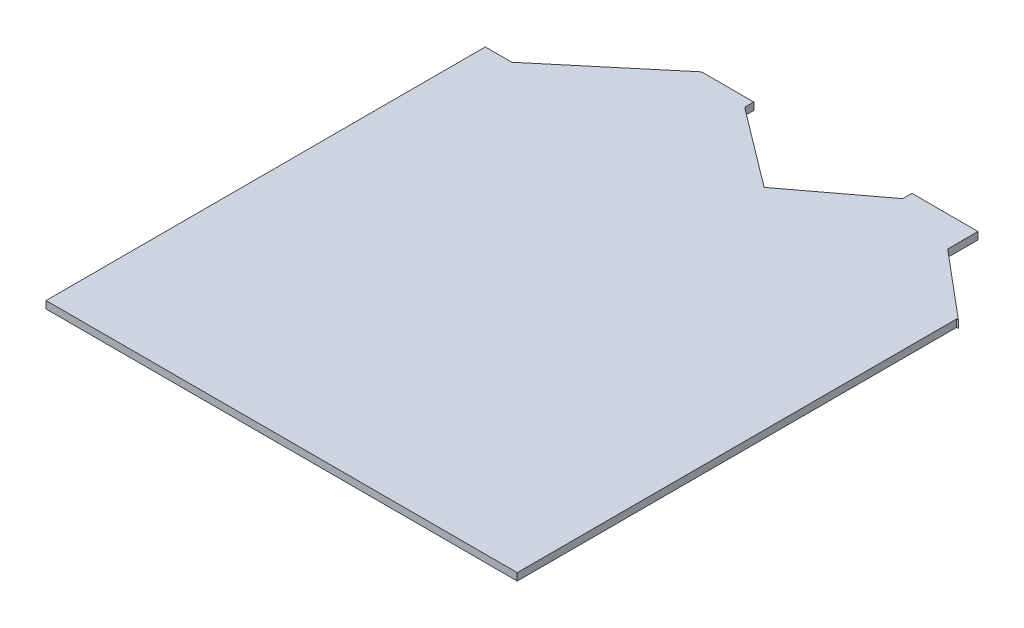
ISO-10303-21;
HEADER;
FILE_DESCRIPTION(('STEP AP214'),'2;1');
FILE_NAME('part.step','',(''),(''),'','','');
FILE_SCHEMA(('AUTOMOTIVE_DESIGN { 1 0 10303 214 1 1 1 1 }'));
ENDSEC;
DATA;
#1=APPLICATION_CONTEXT('core data for automotive mechanical design processes');
#2=APPLICATION_PROTOCOL_DEFINITION('international standard','automotive_design',2000,#1);
#3=PRODUCT_CONTEXT('',#1,'mechanical');
#4=PRODUCT('Part','Part','',(#3));
#5=PRODUCT_RELATED_PRODUCT_CATEGORY('part','',(#4));
#6=PRODUCT_DEFINITION_FORMATION('','',#4);
#7=PRODUCT_DEFINITION_CONTEXT('part definition',#1,'design');
#8=PRODUCT_DEFINITION('design','',#6,#7);
#9=PRODUCT_DEFINITION_SHAPE('','',#8);
#10=(LENGTH_UNIT() NAMED_UNIT(*) SI_UNIT(.MILLI.,.METRE.));
#11=(NAMED_UNIT(*) PLANE_ANGLE_UNIT() SI_UNIT($,.RADIAN.));
#12=(NAMED_UNIT(*) SI_UNIT($,.STERADIAN.) SOLID_ANGLE_UNIT());
#13=UNCERTAINTY_MEASURE_WITH_UNIT(LENGTH_MEASURE(1.E-05),#10,'distance_accuracy_value','');
#14=(GEOMETRIC_REPRESENTATION_CONTEXT(3) GLOBAL_UNCERTAINTY_ASSIGNED_CONTEXT((#13)) GLOBAL_UNIT_ASSIGNED_CONTEXT((#10,
#11,#12)) REPRESENTATION_CONTEXT('',''));
#15=CARTESIAN_POINT('',(0.,0.,0.));
#16=DIRECTION('',(0.,0.,1.));
#17=DIRECTION('',(1.,0.,0.));
#18=AXIS2_PLACEMENT_3D('',#15,#16,#17);
#19=CARTESIAN_POINT('',(950.,1291.,1751.15));
#20=DIRECTION('',(0.,1.,0.));
#21=DIRECTION('',(0.,0.,-1.));
#22=AXIS2_PLACEMENT_3D('',#19,#20,#21);
#23=PLANE('',#22);
#24=DIRECTION('',(1.,0.,0.));
#25=VECTOR('',#24,1.);
#26=CARTESIAN_POINT('',(-1180.,1291.,1751.15));
#27=LINE('',#26,#25);
#28=CARTESIAN_POINT('',(-1180.,1291.,1751.15));
#29=VERTEX_POINT('',#28);
#30=CARTESIAN_POINT('',(950.,1291.,1751.15));
#31=VERTEX_POINT('',#30);
#32=EDGE_CURVE('E40',#29,#31,#27,.T.);
#33=ORIENTED_EDGE('',*,*,#32,.F.);
#34=DIRECTION('',(0.,0.,1.));
#35=VECTOR('',#34,1.);
#36=CARTESIAN_POINT('',(-1180.,1291.,-234.349999999997));
#37=LINE('',#36,#35);
#38=CARTESIAN_POINT('',(-1180.,1291.,-234.349999999997));
#39=VERTEX_POINT('',#38);
#40=EDGE_CURVE('E189',#39,#29,#37,.T.);
#41=ORIENTED_EDGE('',*,*,#40,.F.);
#42=DIRECTION('',(-1.,0.,0.));
#43=VECTOR('',#42,1.);
#44=CARTESIAN_POINT('',(-1060.078564402,1291.,-234.349999999997));
#45=LINE('',#44,#43);
#46=CARTESIAN_POINT('',(-1060.078564402,1291.,-234.349999999997));
#47=VERTEX_POINT('',#46);
#48=EDGE_CURVE('E176',#47,#39,#45,.T.);
#49=ORIENTED_EDGE('',*,*,#48,.F.);
#50=DIRECTION('',(-0.766044443119007,0.,0.642787609686505));
#51=VECTOR('',#50,1.);
#52=CARTESIAN_POINT('',(-594.,1291.,-625.436351489597));
#53=LINE('',#52,#51);
#54=CARTESIAN_POINT('',(-594.,1291.,-625.436351489597));
#55=VERTEX_POINT('',#54);
#56=EDGE_CURVE('E237',#55,#47,#53,.T.);
#57=ORIENTED_EDGE('',*,*,#56,.F.);
#58=DIRECTION('',(-1.,0.,0.));
#59=VECTOR('',#58,1.);
#60=CARTESIAN_POINT('',(-357.5,1291.,-625.436351489597));
#61=LINE('',#60,#59);
#62=CARTESIAN_POINT('',(-357.5,1291.,-625.436351489597));
#63=VERTEX_POINT('',#62);
#64=EDGE_CURVE('E229',#63,#55,#61,.T.);
#65=ORIENTED_EDGE('',*,*,#64,.F.);
#66=DIRECTION('',(0.,0.,-1.));
#67=VECTOR('',#66,1.);
#68=CARTESIAN_POINT('',(-357.5,1291.,-584.245572911747));
#69=LINE('',#68,#67);
#70=CARTESIAN_POINT('',(-357.5,1291.,-584.245572911747));
#71=VERTEX_POINT('',#70);
#72=EDGE_CURVE('E177',#71,#63,#69,.T.);
#73=ORIENTED_EDGE('',*,*,#72,.F.);
#74=DIRECTION('',(-0.798635510047319,0.,-0.601815023152014));
#75=VECTOR('',#74,1.);
#76=CARTESIAN_POINT('',(-1.136868377216E-13,1291.,-314.85));
#77=LINE('',#76,#75);
#78=CARTESIAN_POINT('',(-1.136868377216E-13,1291.,-314.85));
#79=VERTEX_POINT('',#78);
#80=EDGE_CURVE('E155',#79,#71,#77,.T.);
#81=ORIENTED_EDGE('',*,*,#80,.F.);
#82=DIRECTION('',(-0.798635510047319,0.,0.601815023152014));
#83=VECTOR('',#82,1.);
#84=CARTESIAN_POINT('',(357.5,1291.,-584.245572911747));
#85=LINE('',#84,#83);
#86=CARTESIAN_POINT('',(357.5,1291.,-584.245572911747));
#87=VERTEX_POINT('',#86);
#88=EDGE_CURVE('E152',#87,#79,#85,.T.);
#89=ORIENTED_EDGE('',*,*,#88,.F.);
#90=DIRECTION('',(0.,0.,1.));
#91=VECTOR('',#90,1.);
#92=CARTESIAN_POINT('',(357.5,1291.,-625.436351489597));
#93=LINE('',#92,#91);
#94=CARTESIAN_POINT('',(357.5,1291.,-625.436351489597));
#95=VERTEX_POINT('',#94);
#96=EDGE_CURVE('E208',#95,#87,#93,.T.);
#97=ORIENTED_EDGE('',*,*,#96,.F.);
#98=DIRECTION('',(-1.,0.,0.));
#99=VECTOR('',#98,1.);
#100=CARTESIAN_POINT('',(656.,1291.,-625.436351489597));
#101=LINE('',#100,#99);
#102=CARTESIAN_POINT('',(656.,1291.,-625.436351489597));
#103=VERTEX_POINT('',#102);
#104=EDGE_CURVE('E194',#103,#95,#101,.T.);
#105=ORIENTED_EDGE('',*,*,#104,.F.);
#106=DIRECTION('',(0.,0.,-1.));
#107=VECTOR('',#106,1.);
#108=CARTESIAN_POINT('',(656.,1291.,-488.306570105027));
#109=LINE('',#108,#107);
#110=CARTESIAN_POINT('',(656.,1291.,-488.306570105027));
#111=VERTEX_POINT('',#110);
#112=EDGE_CURVE('E195',#111,#103,#109,.T.);
#113=ORIENTED_EDGE('',*,*,#112,.F.);
#114=DIRECTION('',(-0.766044443119007,0.,-0.642787609686505));
#115=VECTOR('',#114,1.);
#116=CARTESIAN_POINT('',(958.6536547856,1291.,-234.349999999997));
#117=LINE('',#116,#115);
#118=CARTESIAN_POINT('',(958.6536547856,1291.,-234.349999999997));
#119=VERTEX_POINT('',#118);
#120=EDGE_CURVE('E21',#119,#111,#117,.T.);
#121=ORIENTED_EDGE('',*,*,#120,.F.);
#122=DIRECTION('',(1.,0.,0.));
#123=VECTOR('',#122,1.);
#124=CARTESIAN_POINT('',(950.,1291.,-234.349999999997));
#125=LINE('',#124,#123);
#126=CARTESIAN_POINT('',(950.,1291.,-234.349999999997));
#127=VERTEX_POINT('',#126);
#128=EDGE_CURVE('E184',#127,#119,#125,.T.);
#129=ORIENTED_EDGE('',*,*,#128,.F.);
#130=DIRECTION('',(0.,0.,-1.));
#131=VECTOR('',#130,1.);
#132=CARTESIAN_POINT('',(950.,1291.,1751.15));
#133=LINE('',#132,#131);
#134=EDGE_CURVE('E11',#31,#127,#133,.T.);
#135=ORIENTED_EDGE('',*,*,#134,.F.);
#136=EDGE_LOOP('',(#33,#41,#49,#57,#65,#73,#81,#89,#97,#105,#113,#121,#129,#135));
#137=FACE_BOUND('',#136,.T.);
#138=ADVANCED_FACE('F17',(#137),#23,.F.);
#139=CARTESIAN_POINT('',(950.,1291.,1751.15));
#140=DIRECTION('',(1.,0.,0.));
#141=DIRECTION('',(0.,0.,1.));
#142=AXIS2_PLACEMENT_3D('',#139,#140,#141);
#143=PLANE('',#142);
#144=DIRECTION('',(0.,0.,-1.));
#145=VECTOR('',#144,1.);
#146=CARTESIAN_POINT('',(950.,1324.,1751.15));
#147=LINE('',#146,#145);
#148=CARTESIAN_POINT('',(950.,1324.,1751.15));
#149=VERTEX_POINT('',#148);
#150=CARTESIAN_POINT('',(950.,1324.,-234.349999999997));
#151=VERTEX_POINT('',#150);
#152=EDGE_CURVE('E245',#149,#151,#147,.T.);
#153=ORIENTED_EDGE('',*,*,#152,.F.);
#154=DIRECTION('',(0.,1.,0.));
#155=VECTOR('',#154,1.);
#156=CARTESIAN_POINT('',(950.,1291.,1751.15));
#157=LINE('',#156,#155);
#158=EDGE_CURVE('E185',#31,#149,#157,.T.);
#159=ORIENTED_EDGE('',*,*,#158,.F.);
#160=ORIENTED_EDGE('',*,*,#134,.T.);
#161=DIRECTION('',(0.,1.,0.));
#162=VECTOR('',#161,1.);
#163=CARTESIAN_POINT('',(950.,1291.,-234.349999999997));
#164=LINE('',#163,#162);
#165=EDGE_CURVE('E28',#127,#151,#164,.T.);
#166=ORIENTED_EDGE('',*,*,#165,.T.);
#167=EDGE_LOOP('',(#153,#159,#160,#166));
#168=FACE_BOUND('',#167,.T.);
#169=ADVANCED_FACE('F332',(#168),#143,.T.);
#170=CARTESIAN_POINT('',(-1060.078564402,1291.,-234.349999999997));
#171=DIRECTION('',(0.,0.,1.));
#172=DIRECTION('',(1.,0.,0.));
#173=AXIS2_PLACEMENT_3D('',#170,#171,#172);
#174=PLANE('',#173);
#175=ORIENTED_EDGE('',*,*,#128,.T.);
#176=DIRECTION('',(0.,1.,0.));
#177=VECTOR('',#176,1.);
#178=CARTESIAN_POINT('',(958.6536547856,1291.,-234.349999999997));
#179=LINE('',#178,#177);
#180=CARTESIAN_POINT('',(958.6536547856,1324.,-234.349999999997));
#181=VERTEX_POINT('',#180);
#182=EDGE_CURVE('E216',#119,#181,#179,.T.);
#183=ORIENTED_EDGE('',*,*,#182,.T.);
#184=DIRECTION('',(1.,0.,0.));
#185=VECTOR('',#184,1.);
#186=CARTESIAN_POINT('',(950.,1324.,-234.349999999997));
#187=LINE('',#186,#185);
#188=EDGE_CURVE('E249',#151,#181,#187,.T.);
#189=ORIENTED_EDGE('',*,*,#188,.F.);
#190=ORIENTED_EDGE('',*,*,#165,.F.);
#191=EDGE_LOOP('',(#175,#183,#189,#190));
#192=FACE_BOUND('',#191,.T.);
#193=ADVANCED_FACE('F338',(#192),#174,.T.);
#194=CARTESIAN_POINT('',(107.,1324.,1640.65));
#195=DIRECTION('',(0.,-1.,0.));
#196=DIRECTION('',(1.,0.,0.));
#197=AXIS2_PLACEMENT_3D('',#194,#195,#196);
#198=PLANE('',#197);
#199=DIRECTION('',(0.,0.,1.));
#200=VECTOR('',#199,1.);
#201=CARTESIAN_POINT('',(-1180.,1324.,-234.349999999997));
#202=LINE('',#201,#200);
#203=CARTESIAN_POINT('',(-1180.,1324.,-234.349999999997));
#204=VERTEX_POINT('',#203);
#205=CARTESIAN_POINT('',(-1180.,1324.,1751.15));
#206=VERTEX_POINT('',#205);
#207=EDGE_CURVE('E213',#204,#206,#202,.T.);
#208=ORIENTED_EDGE('',*,*,#207,.T.);
#209=DIRECTION('',(1.,0.,0.));
#210=VECTOR('',#209,1.);
#211=CARTESIAN_POINT('',(-1180.,1324.,1751.15));
#212=LINE('',#211,#210);
#213=EDGE_CURVE('E217',#206,#149,#212,.T.);
#214=ORIENTED_EDGE('',*,*,#213,.T.);
#215=ORIENTED_EDGE('',*,*,#152,.T.);
#216=ORIENTED_EDGE('',*,*,#188,.T.);
#217=DIRECTION('',(-0.766044443119007,0.,-0.642787609686505));
#218=VECTOR('',#217,1.);
#219=CARTESIAN_POINT('',(958.6536547856,1324.,-234.349999999997));
#220=LINE('',#219,#218);
#221=CARTESIAN_POINT('',(656.,1324.,-488.306570105027));
#222=VERTEX_POINT('',#221);
#223=EDGE_CURVE('E250',#181,#222,#220,.T.);
#224=ORIENTED_EDGE('',*,*,#223,.T.);
#225=DIRECTION('',(0.,0.,-1.));
#226=VECTOR('',#225,1.);
#227=CARTESIAN_POINT('',(656.,1324.,-488.306570105027));
#228=LINE('',#227,#226);
#229=CARTESIAN_POINT('',(656.,1324.,-625.436351489597));
#230=VERTEX_POINT('',#229);
#231=EDGE_CURVE('E165',#222,#230,#228,.T.);
#232=ORIENTED_EDGE('',*,*,#231,.T.);
#233=DIRECTION('',(-1.,0.,0.));
#234=VECTOR('',#233,1.);
#235=CARTESIAN_POINT('',(656.,1324.,-625.436351489597));
#236=LINE('',#235,#234);
#237=CARTESIAN_POINT('',(357.5,1324.,-625.436351489597));
#238=VERTEX_POINT('',#237);
#239=EDGE_CURVE('E196',#230,#238,#236,.T.);
#240=ORIENTED_EDGE('',*,*,#239,.T.);
#241=DIRECTION('',(0.,0.,1.));
#242=VECTOR('',#241,1.);
#243=CARTESIAN_POINT('',(357.5,1324.,-625.436351489597));
#244=LINE('',#243,#242);
#245=CARTESIAN_POINT('',(357.5,1324.,-584.245572911747));
#246=VERTEX_POINT('',#245);
#247=EDGE_CURVE('E144',#238,#246,#244,.T.);
#248=ORIENTED_EDGE('',*,*,#247,.T.);
#249=DIRECTION('',(-0.798635510047319,0.,0.601815023152014));
#250=VECTOR('',#249,1.);
#251=CARTESIAN_POINT('',(357.5,1324.,-584.245572911747));
#252=LINE('',#251,#250);
#253=CARTESIAN_POINT('',(0.,1324.,-314.85));
#254=VERTEX_POINT('',#253);
#255=EDGE_CURVE('E136',#246,#254,#252,.T.);
#256=ORIENTED_EDGE('',*,*,#255,.T.);
#257=DIRECTION('',(-0.798635510047319,0.,-0.601815023152014));
#258=VECTOR('',#257,1.);
#259=CARTESIAN_POINT('',(0.,1324.,-314.85));
#260=LINE('',#259,#258);
#261=CARTESIAN_POINT('',(-357.5,1324.,-584.245572911747));
#262=VERTEX_POINT('',#261);
#263=EDGE_CURVE('E126',#254,#262,#260,.T.);
#264=ORIENTED_EDGE('',*,*,#263,.T.);
#265=DIRECTION('',(0.,0.,-1.));
#266=VECTOR('',#265,1.);
#267=CARTESIAN_POINT('',(-357.5,1324.,-584.245572911747));
#268=LINE('',#267,#266);
#269=CARTESIAN_POINT('',(-357.5,1324.,-625.436351489597));
#270=VERTEX_POINT('',#269);
#271=EDGE_CURVE('E137',#262,#270,#268,.T.);
#272=ORIENTED_EDGE('',*,*,#271,.T.);
#273=DIRECTION('',(-1.,0.,0.));
#274=VECTOR('',#273,1.);
#275=CARTESIAN_POINT('',(-357.5,1324.,-625.436351489597));
#276=LINE('',#275,#274);
#277=CARTESIAN_POINT('',(-594.,1324.,-625.436351489597));
#278=VERTEX_POINT('',#277);
#279=EDGE_CURVE('E171',#270,#278,#276,.T.);
#280=ORIENTED_EDGE('',*,*,#279,.T.);
#281=DIRECTION('',(-0.766044443119007,0.,0.642787609686505));
#282=VECTOR('',#281,1.);
#283=CARTESIAN_POINT('',(-594.,1324.,-625.436351489597));
#284=LINE('',#283,#282);
#285=CARTESIAN_POINT('',(-1060.078564402,1324.,-234.349999999997));
#286=VERTEX_POINT('',#285);
#287=EDGE_CURVE('E167',#278,#286,#284,.T.);
#288=ORIENTED_EDGE('',*,*,#287,.T.);
#289=DIRECTION('',(-1.,0.,0.));
#290=VECTOR('',#289,1.);
#291=CARTESIAN_POINT('',(-1060.078564402,1324.,-234.349999999997));
#292=LINE('',#291,#290);
#293=EDGE_CURVE('E172',#286,#204,#292,.T.);
#294=ORIENTED_EDGE('',*,*,#293,.T.);
#295=EDGE_LOOP('',(#208,#214,#215,#216,#224,#232,#240,#248,#256,#264,#272,#280,#288,#294));
#296=FACE_BOUND('',#295,.T.);
#297=ADVANCED_FACE('F141',(#296),#198,.F.);
#298=CARTESIAN_POINT('',(950.,1291.,-234.349999999997));
#299=DIRECTION('',(0.,0.,-1.));
#300=DIRECTION('',(0.,1.,0.));
#301=AXIS2_PLACEMENT_3D('',#298,#299,#300);
#302=PLANE('',#301);
#303=ORIENTED_EDGE('',*,*,#48,.T.);
#304=DIRECTION('',(0.,1.,0.));
#305=VECTOR('',#304,1.);
#306=CARTESIAN_POINT('',(-1180.,1291.,-234.349999999997));
#307=LINE('',#306,#305);
#308=EDGE_CURVE('E207',#39,#204,#307,.T.);
#309=ORIENTED_EDGE('',*,*,#308,.T.);
#310=ORIENTED_EDGE('',*,*,#293,.F.);
#311=DIRECTION('',(0.,1.,0.));
#312=VECTOR('',#311,1.);
#313=CARTESIAN_POINT('',(-1060.078564402,1291.,-234.349999999997));
#314=LINE('',#313,#312);
#315=EDGE_CURVE('E228',#47,#286,#314,.T.);
#316=ORIENTED_EDGE('',*,*,#315,.F.);
#317=EDGE_LOOP('',(#303,#309,#310,#316));
#318=FACE_BOUND('',#317,.T.);
#319=ADVANCED_FACE('F319',(#318),#302,.T.);
#320=CARTESIAN_POINT('',(-594.,1291.,-625.436351489597));
#321=DIRECTION('',(-0.642787609686505,0.,-0.766044443119007));
#322=DIRECTION('',(-0.766044443119007,0.,0.642787609686505));
#323=AXIS2_PLACEMENT_3D('',#320,#321,#322);
#324=PLANE('',#323);
#325=ORIENTED_EDGE('',*,*,#287,.F.);
#326=DIRECTION('',(0.,1.,0.));
#327=VECTOR('',#326,1.);
#328=CARTESIAN_POINT('',(-594.,1291.,-625.436351489597));
#329=LINE('',#328,#327);
#330=EDGE_CURVE('E224',#55,#278,#329,.T.);
#331=ORIENTED_EDGE('',*,*,#330,.F.);
#332=ORIENTED_EDGE('',*,*,#56,.T.);
#333=ORIENTED_EDGE('',*,*,#315,.T.);
#334=EDGE_LOOP('',(#325,#331,#332,#333));
#335=FACE_BOUND('',#334,.T.);
#336=ADVANCED_FACE('F328',(#335),#324,.T.);
#337=CARTESIAN_POINT('',(-357.5,1291.,-625.436351489597));
#338=DIRECTION('',(0.,0.,-1.));
#339=DIRECTION('',(0.,1.,0.));
#340=AXIS2_PLACEMENT_3D('',#337,#338,#339);
#341=PLANE('',#340);
#342=ORIENTED_EDGE('',*,*,#330,.T.);
#343=ORIENTED_EDGE('',*,*,#279,.F.);
#344=DIRECTION('',(0.,1.,0.));
#345=VECTOR('',#344,1.);
#346=CARTESIAN_POINT('',(-357.5,1291.,-625.436351489597));
#347=LINE('',#346,#345);
#348=EDGE_CURVE('E180',#63,#270,#347,.T.);
#349=ORIENTED_EDGE('',*,*,#348,.F.);
#350=ORIENTED_EDGE('',*,*,#64,.T.);
#351=EDGE_LOOP('',(#342,#343,#349,#350));
#352=FACE_BOUND('',#351,.T.);
#353=ADVANCED_FACE('F365',(#352),#341,.T.);
#354=CARTESIAN_POINT('',(-357.5,1291.,-584.245572911747));
#355=DIRECTION('',(1.,0.,0.));
#356=DIRECTION('',(0.,0.,1.));
#357=AXIS2_PLACEMENT_3D('',#354,#355,#356);
#358=PLANE('',#357);
#359=ORIENTED_EDGE('',*,*,#348,.T.);
#360=ORIENTED_EDGE('',*,*,#271,.F.);
#361=DIRECTION('',(0.,1.,0.));
#362=VECTOR('',#361,1.);
#363=CARTESIAN_POINT('',(-357.5,1291.,-584.245572911747));
#364=LINE('',#363,#362);
#365=EDGE_CURVE('E132',#71,#262,#364,.T.);
#366=ORIENTED_EDGE('',*,*,#365,.F.);
#367=ORIENTED_EDGE('',*,*,#72,.T.);
#368=EDGE_LOOP('',(#359,#360,#366,#367));
#369=FACE_BOUND('',#368,.T.);
#370=ADVANCED_FACE('F19',(#369),#358,.T.);
#371=CARTESIAN_POINT('',(0.,1291.,-314.85));
#372=DIRECTION('',(0.601815023152014,0.,-0.798635510047319));
#373=DIRECTION('',(0.,1.,0.));
#374=AXIS2_PLACEMENT_3D('',#371,#372,#373);
#375=PLANE('',#374);
#376=ORIENTED_EDGE('',*,*,#365,.T.);
#377=ORIENTED_EDGE('',*,*,#263,.F.);
#378=DIRECTION('',(0.,1.,0.));
#379=VECTOR('',#378,1.);
#380=CARTESIAN_POINT('',(-1.136868377216E-13,1291.,-314.85));
#381=LINE('',#380,#379);
#382=EDGE_CURVE('E130',#79,#254,#381,.T.);
#383=ORIENTED_EDGE('',*,*,#382,.F.);
#384=ORIENTED_EDGE('',*,*,#80,.T.);
#385=EDGE_LOOP('',(#376,#377,#383,#384));
#386=FACE_BOUND('',#385,.T.);
#387=ADVANCED_FACE('F128',(#386),#375,.T.);
#388=CARTESIAN_POINT('',(357.5,1291.,-584.245572911747));
#389=DIRECTION('',(-0.601815023152014,0.,-0.798635510047319));
#390=DIRECTION('',(-0.798635510047319,0.,0.601815023152014));
#391=AXIS2_PLACEMENT_3D('',#388,#389,#390);
#392=PLANE('',#391);
#393=ORIENTED_EDGE('',*,*,#382,.T.);
#394=ORIENTED_EDGE('',*,*,#255,.F.);
#395=DIRECTION('',(0.,1.,0.));
#396=VECTOR('',#395,1.);
#397=CARTESIAN_POINT('',(357.5,1291.,-584.245572911747));
#398=LINE('',#397,#396);
#399=EDGE_CURVE('E161',#87,#246,#398,.T.);
#400=ORIENTED_EDGE('',*,*,#399,.F.);
#401=ORIENTED_EDGE('',*,*,#88,.T.);
#402=EDGE_LOOP('',(#393,#394,#400,#401));
#403=FACE_BOUND('',#402,.T.);
#404=ADVANCED_FACE('F150',(#403),#392,.T.);
#405=CARTESIAN_POINT('',(357.5,1291.,-625.436351489597));
#406=DIRECTION('',(-1.,0.,0.));
#407=DIRECTION('',(0.,-1.,0.));
#408=AXIS2_PLACEMENT_3D('',#405,#406,#407);
#409=PLANE('',#408);
#410=ORIENTED_EDGE('',*,*,#399,.T.);
#411=ORIENTED_EDGE('',*,*,#247,.F.);
#412=DIRECTION('',(0.,1.,0.));
#413=VECTOR('',#412,1.);
#414=CARTESIAN_POINT('',(357.5,1291.,-625.436351489597));
#415=LINE('',#414,#413);
#416=EDGE_CURVE('E212',#95,#238,#415,.T.);
#417=ORIENTED_EDGE('',*,*,#416,.F.);
#418=ORIENTED_EDGE('',*,*,#96,.T.);
#419=EDGE_LOOP('',(#410,#411,#417,#418));
#420=FACE_BOUND('',#419,.T.);
#421=ADVANCED_FACE('F286',(#420),#409,.T.);
#422=CARTESIAN_POINT('',(656.,1291.,-625.436351489597));
#423=DIRECTION('',(0.,0.,-1.));
#424=DIRECTION('',(0.,1.,0.));
#425=AXIS2_PLACEMENT_3D('',#422,#423,#424);
#426=PLANE('',#425);
#427=ORIENTED_EDGE('',*,*,#416,.T.);
#428=ORIENTED_EDGE('',*,*,#239,.F.);
#429=DIRECTION('',(0.,1.,0.));
#430=VECTOR('',#429,1.);
#431=CARTESIAN_POINT('',(656.,1291.,-625.436351489597));
#432=LINE('',#431,#430);
#433=EDGE_CURVE('E190',#103,#230,#432,.T.);
#434=ORIENTED_EDGE('',*,*,#433,.F.);
#435=ORIENTED_EDGE('',*,*,#104,.T.);
#436=EDGE_LOOP('',(#427,#428,#434,#435));
#437=FACE_BOUND('',#436,.T.);
#438=ADVANCED_FACE('F268',(#437),#426,.T.);
#439=CARTESIAN_POINT('',(656.,1291.,-488.306570105027));
#440=DIRECTION('',(1.,0.,0.));
#441=DIRECTION('',(0.,0.,1.));
#442=AXIS2_PLACEMENT_3D('',#439,#440,#441);
#443=PLANE('',#442);
#444=ORIENTED_EDGE('',*,*,#433,.T.);
#445=ORIENTED_EDGE('',*,*,#231,.F.);
#446=DIRECTION('',(0.,1.,0.));
#447=VECTOR('',#446,1.);
#448=CARTESIAN_POINT('',(656.,1291.,-488.306570105027));
#449=LINE('',#448,#447);
#450=EDGE_CURVE('E235',#111,#222,#449,.T.);
#451=ORIENTED_EDGE('',*,*,#450,.F.);
#452=ORIENTED_EDGE('',*,*,#112,.T.);
#453=EDGE_LOOP('',(#444,#445,#451,#452));
#454=FACE_BOUND('',#453,.T.);
#455=ADVANCED_FACE('F264',(#454),#443,.T.);
#456=CARTESIAN_POINT('',(958.6536547856,1291.,-234.349999999997));
#457=DIRECTION('',(0.642787609686505,0.,-0.766044443119007));
#458=DIRECTION('',(0.,1.,0.));
#459=AXIS2_PLACEMENT_3D('',#456,#457,#458);
#460=PLANE('',#459);
#461=ORIENTED_EDGE('',*,*,#450,.T.);
#462=ORIENTED_EDGE('',*,*,#223,.F.);
#463=ORIENTED_EDGE('',*,*,#182,.F.);
#464=ORIENTED_EDGE('',*,*,#120,.T.);
#465=EDGE_LOOP('',(#461,#462,#463,#464));
#466=FACE_BOUND('',#465,.T.);
#467=ADVANCED_FACE('F347',(#466),#460,.T.);
#468=CARTESIAN_POINT('',(-1180.,1291.,-234.349999999997));
#469=DIRECTION('',(-1.,0.,0.));
#470=DIRECTION('',(0.,-1.,0.));
#471=AXIS2_PLACEMENT_3D('',#468,#469,#470);
#472=PLANE('',#471);
#473=DIRECTION('',(0.,1.,0.));
#474=VECTOR('',#473,1.);
#475=CARTESIAN_POINT('',(-1180.,1291.,1751.15));
#476=LINE('',#475,#474);
#477=EDGE_CURVE('E200',#29,#206,#476,.T.);
#478=ORIENTED_EDGE('',*,*,#477,.T.);
#479=ORIENTED_EDGE('',*,*,#207,.F.);
#480=ORIENTED_EDGE('',*,*,#308,.F.);
#481=ORIENTED_EDGE('',*,*,#40,.T.);
#482=EDGE_LOOP('',(#478,#479,#480,#481));
#483=FACE_BOUND('',#482,.T.);
#484=ADVANCED_FACE('F324',(#483),#472,.T.);
#485=CARTESIAN_POINT('',(-1180.,1291.,1751.15));
#486=DIRECTION('',(0.,0.,1.));
#487=DIRECTION('',(1.,0.,0.));
#488=AXIS2_PLACEMENT_3D('',#485,#486,#487);
#489=PLANE('',#488);
#490=ORIENTED_EDGE('',*,*,#158,.T.);
#491=ORIENTED_EDGE('',*,*,#213,.F.);
#492=ORIENTED_EDGE('',*,*,#477,.F.);
#493=ORIENTED_EDGE('',*,*,#32,.T.);
#494=EDGE_LOOP('',(#490,#491,#492,#493));
#495=FACE_BOUND('',#494,.T.);
#496=ADVANCED_FACE('F355',(#495),#489,.T.);
#497=CLOSED_SHELL('',(#138,#169,#193,#297,#319,#336,#353,#370,#387,#404,#421,#438,#455,#467,
#484,#496));
#498=MANIFOLD_SOLID_BREP('B1',#497);
#499=ADVANCED_BREP_SHAPE_REPRESENTATION('',(#18,#498),#14);
#500=SHAPE_DEFINITION_REPRESENTATION(#9,#499);
ENDSEC;
END-ISO-10303-21;
